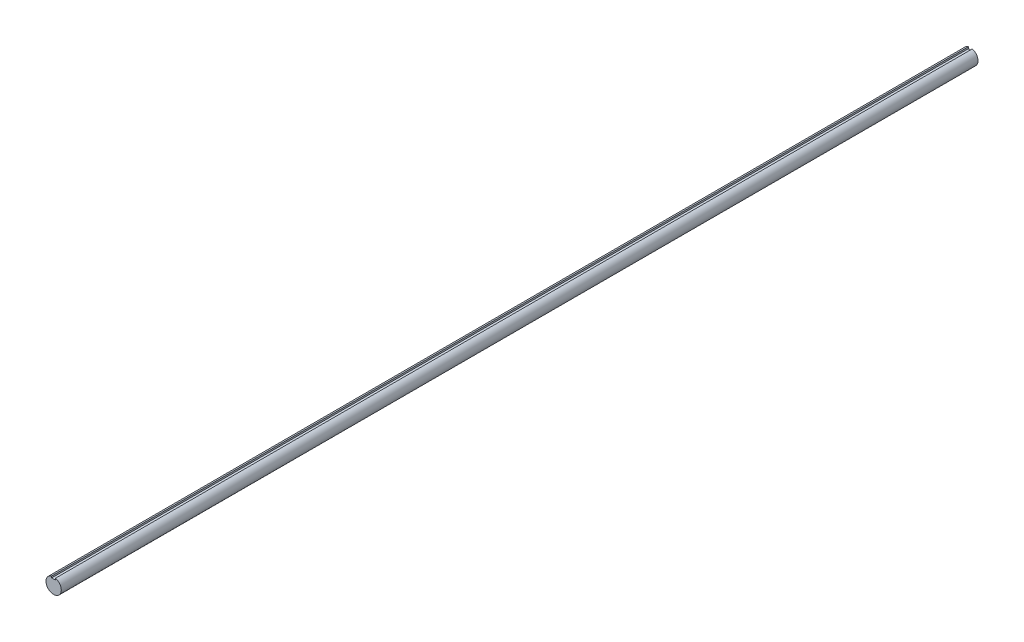
ISO-10303-21;
HEADER;
FILE_DESCRIPTION(('STEP AP214'),'2;1');
FILE_NAME('part.step','',(''),(''),'','','');
FILE_SCHEMA(('AUTOMOTIVE_DESIGN { 1 0 10303 214 1 1 1 1 }'));
ENDSEC;
DATA;
#1=APPLICATION_CONTEXT('core data for automotive mechanical design processes');
#2=APPLICATION_PROTOCOL_DEFINITION('international standard','automotive_design',2000,#1);
#3=PRODUCT_CONTEXT('',#1,'mechanical');
#4=PRODUCT('Part','Part','',(#3));
#5=PRODUCT_RELATED_PRODUCT_CATEGORY('part','',(#4));
#6=PRODUCT_DEFINITION_FORMATION('','',#4);
#7=PRODUCT_DEFINITION_CONTEXT('part definition',#1,'design');
#8=PRODUCT_DEFINITION('design','',#6,#7);
#9=PRODUCT_DEFINITION_SHAPE('','',#8);
#10=(LENGTH_UNIT() NAMED_UNIT(*) SI_UNIT(.MILLI.,.METRE.));
#11=(NAMED_UNIT(*) PLANE_ANGLE_UNIT() SI_UNIT($,.RADIAN.));
#12=(NAMED_UNIT(*) SI_UNIT($,.STERADIAN.) SOLID_ANGLE_UNIT());
#13=UNCERTAINTY_MEASURE_WITH_UNIT(LENGTH_MEASURE(1.E-05),#10,'distance_accuracy_value','');
#14=(GEOMETRIC_REPRESENTATION_CONTEXT(3) GLOBAL_UNCERTAINTY_ASSIGNED_CONTEXT((#13)) GLOBAL_UNIT_ASSIGNED_CONTEXT((#10,
#11,#12)) REPRESENTATION_CONTEXT('',''));
#15=CARTESIAN_POINT('',(0.,0.,0.));
#16=DIRECTION('',(0.,0.,1.));
#17=DIRECTION('',(1.,0.,0.));
#18=AXIS2_PLACEMENT_3D('',#15,#16,#17);
#19=CARTESIAN_POINT('',(0.,0.,381.));
#20=DIRECTION('',(0.,0.,-1.));
#21=DIRECTION('',(-1.,0.,0.));
#22=AXIS2_PLACEMENT_3D('',#19,#20,#21);
#23=CYLINDRICAL_SURFACE('',#22,6.35000000000001);
#24=CARTESIAN_POINT('',(0.,0.,-381.));
#25=DIRECTION('',(0.,0.,1.));
#26=DIRECTION('',(1.,0.,0.));
#27=AXIS2_PLACEMENT_3D('',#24,#25,#26);
#28=CIRCLE('',#27,6.35000000000001);
#29=CARTESIAN_POINT('',(-1.58750000000001,6.14836106210428,-381.));
#30=VERTEX_POINT('',#29);
#31=CARTESIAN_POINT('',(1.58749999999999,6.14836106210428,-381.));
#32=VERTEX_POINT('',#31);
#33=EDGE_CURVE('E98',#30,#32,#28,.T.);
#34=ORIENTED_EDGE('',*,*,#33,.T.);
#35=DIRECTION('',(0.,0.,-1.));
#36=VECTOR('',#35,1.);
#37=CARTESIAN_POINT('',(1.58749999999999,6.14836106210428,381.));
#38=LINE('',#37,#36);
#39=CARTESIAN_POINT('',(1.58749999999999,6.14836106210428,381.));
#40=VERTEX_POINT('',#39);
#41=EDGE_CURVE('E11',#40,#32,#38,.T.);
#42=ORIENTED_EDGE('',*,*,#41,.F.);
#43=CARTESIAN_POINT('',(0.,0.,381.));
#44=DIRECTION('',(0.,0.,1.));
#45=DIRECTION('',(1.,0.,0.));
#46=AXIS2_PLACEMENT_3D('',#43,#44,#45);
#47=CIRCLE('',#46,6.35000000000001);
#48=CARTESIAN_POINT('',(-1.58750000000001,6.14836106210428,381.));
#49=VERTEX_POINT('',#48);
#50=EDGE_CURVE('E86',#49,#40,#47,.T.);
#51=ORIENTED_EDGE('',*,*,#50,.F.);
#52=DIRECTION('',(0.,0.,-1.));
#53=VECTOR('',#52,1.);
#54=CARTESIAN_POINT('',(-1.58750000000001,6.14836106210428,381.));
#55=LINE('',#54,#53);
#56=EDGE_CURVE('E94',#49,#30,#55,.T.);
#57=ORIENTED_EDGE('',*,*,#56,.T.);
#58=EDGE_LOOP('',(#34,#42,#51,#57));
#59=FACE_BOUND('',#58,.T.);
#60=ADVANCED_FACE('F35',(#59),#23,.T.);
#61=CARTESIAN_POINT('',(1.58749999999999,4.7625,381.));
#62=DIRECTION('',(1.,0.,0.));
#63=DIRECTION('',(0.,0.,-1.));
#64=AXIS2_PLACEMENT_3D('',#61,#62,#63);
#65=PLANE('',#64);
#66=DIRECTION('',(0.,-1.,0.));
#67=VECTOR('',#66,1.);
#68=CARTESIAN_POINT('',(1.58749999999999,4.7625,-381.));
#69=LINE('',#68,#67);
#70=CARTESIAN_POINT('',(1.58749999999999,4.7625,-381.));
#71=VERTEX_POINT('',#70);
#72=EDGE_CURVE('E90',#32,#71,#69,.T.);
#73=ORIENTED_EDGE('',*,*,#72,.T.);
#74=DIRECTION('',(0.,0.,-1.));
#75=VECTOR('',#74,1.);
#76=CARTESIAN_POINT('',(1.58749999999999,4.7625,381.));
#77=LINE('',#76,#75);
#78=CARTESIAN_POINT('',(1.58749999999999,4.7625,381.));
#79=VERTEX_POINT('',#78);
#80=EDGE_CURVE('E43',#79,#71,#77,.T.);
#81=ORIENTED_EDGE('',*,*,#80,.F.);
#82=DIRECTION('',(0.,-1.,0.));
#83=VECTOR('',#82,1.);
#84=CARTESIAN_POINT('',(1.58749999999999,4.7625,381.));
#85=LINE('',#84,#83);
#86=EDGE_CURVE('E81',#40,#79,#85,.T.);
#87=ORIENTED_EDGE('',*,*,#86,.F.);
#88=ORIENTED_EDGE('',*,*,#41,.T.);
#89=EDGE_LOOP('',(#73,#81,#87,#88));
#90=FACE_BOUND('',#89,.T.);
#91=ADVANCED_FACE('F89',(#90),#65,.F.);
#92=CARTESIAN_POINT('',(-1.58750000000001,4.7625,381.));
#93=DIRECTION('',(0.,-1.,0.));
#94=DIRECTION('',(0.,0.,-1.));
#95=AXIS2_PLACEMENT_3D('',#92,#93,#94);
#96=PLANE('',#95);
#97=DIRECTION('',(-1.,0.,0.));
#98=VECTOR('',#97,1.);
#99=CARTESIAN_POINT('',(-1.58750000000001,4.7625,-381.));
#100=LINE('',#99,#98);
#101=CARTESIAN_POINT('',(-1.58750000000001,4.7625,-381.));
#102=VERTEX_POINT('',#101);
#103=EDGE_CURVE('E68',#71,#102,#100,.T.);
#104=ORIENTED_EDGE('',*,*,#103,.T.);
#105=DIRECTION('',(0.,0.,-1.));
#106=VECTOR('',#105,1.);
#107=CARTESIAN_POINT('',(-1.58750000000001,4.7625,381.));
#108=LINE('',#107,#106);
#109=CARTESIAN_POINT('',(-1.58750000000001,4.7625,381.));
#110=VERTEX_POINT('',#109);
#111=EDGE_CURVE('E91',#110,#102,#108,.T.);
#112=ORIENTED_EDGE('',*,*,#111,.F.);
#113=DIRECTION('',(-1.,0.,0.));
#114=VECTOR('',#113,1.);
#115=CARTESIAN_POINT('',(-1.58750000000001,4.7625,381.));
#116=LINE('',#115,#114);
#117=EDGE_CURVE('E84',#79,#110,#116,.T.);
#118=ORIENTED_EDGE('',*,*,#117,.F.);
#119=ORIENTED_EDGE('',*,*,#80,.T.);
#120=EDGE_LOOP('',(#104,#112,#118,#119));
#121=FACE_BOUND('',#120,.T.);
#122=ADVANCED_FACE('F92',(#121),#96,.F.);
#123=CARTESIAN_POINT('',(-1.58750000000001,6.14836106210428,381.));
#124=DIRECTION('',(-1.,0.,0.));
#125=DIRECTION('',(0.,0.,1.));
#126=AXIS2_PLACEMENT_3D('',#123,#124,#125);
#127=PLANE('',#126);
#128=DIRECTION('',(0.,1.,0.));
#129=VECTOR('',#128,1.);
#130=CARTESIAN_POINT('',(-1.58750000000001,6.14836106210428,-381.));
#131=LINE('',#130,#129);
#132=EDGE_CURVE('E74',#102,#30,#131,.T.);
#133=ORIENTED_EDGE('',*,*,#132,.T.);
#134=ORIENTED_EDGE('',*,*,#56,.F.);
#135=DIRECTION('',(0.,1.,0.));
#136=VECTOR('',#135,1.);
#137=CARTESIAN_POINT('',(-1.58750000000001,6.14836106210428,381.));
#138=LINE('',#137,#136);
#139=EDGE_CURVE('E51',#110,#49,#138,.T.);
#140=ORIENTED_EDGE('',*,*,#139,.F.);
#141=ORIENTED_EDGE('',*,*,#111,.T.);
#142=EDGE_LOOP('',(#133,#134,#140,#141));
#143=FACE_BOUND('',#142,.T.);
#144=ADVANCED_FACE('F105',(#143),#127,.F.);
#145=CARTESIAN_POINT('',(0.,0.,381.));
#146=DIRECTION('',(0.,0.,1.));
#147=DIRECTION('',(1.,0.,0.));
#148=AXIS2_PLACEMENT_3D('',#145,#146,#147);
#149=PLANE('',#148);
#150=ORIENTED_EDGE('',*,*,#50,.T.);
#151=ORIENTED_EDGE('',*,*,#86,.T.);
#152=ORIENTED_EDGE('',*,*,#117,.T.);
#153=ORIENTED_EDGE('',*,*,#139,.T.);
#154=EDGE_LOOP('',(#150,#151,#152,#153));
#155=FACE_BOUND('',#154,.T.);
#156=ADVANCED_FACE('F82',(#155),#149,.T.);
#157=CARTESIAN_POINT('',(0.,0.,-381.));
#158=DIRECTION('',(0.,0.,1.));
#159=DIRECTION('',(1.,0.,0.));
#160=AXIS2_PLACEMENT_3D('',#157,#158,#159);
#161=PLANE('',#160);
#162=ORIENTED_EDGE('',*,*,#33,.F.);
#163=ORIENTED_EDGE('',*,*,#132,.F.);
#164=ORIENTED_EDGE('',*,*,#103,.F.);
#165=ORIENTED_EDGE('',*,*,#72,.F.);
#166=EDGE_LOOP('',(#162,#163,#164,#165));
#167=FACE_BOUND('',#166,.T.);
#168=ADVANCED_FACE('F108',(#167),#161,.F.);
#169=CLOSED_SHELL('',(#60,#91,#122,#144,#156,#168));
#170=MANIFOLD_SOLID_BREP('B2',#169);
#171=ADVANCED_BREP_SHAPE_REPRESENTATION('',(#18,#170),#14);
#172=SHAPE_DEFINITION_REPRESENTATION(#9,#171);
ENDSEC;
END-ISO-10303-21;
